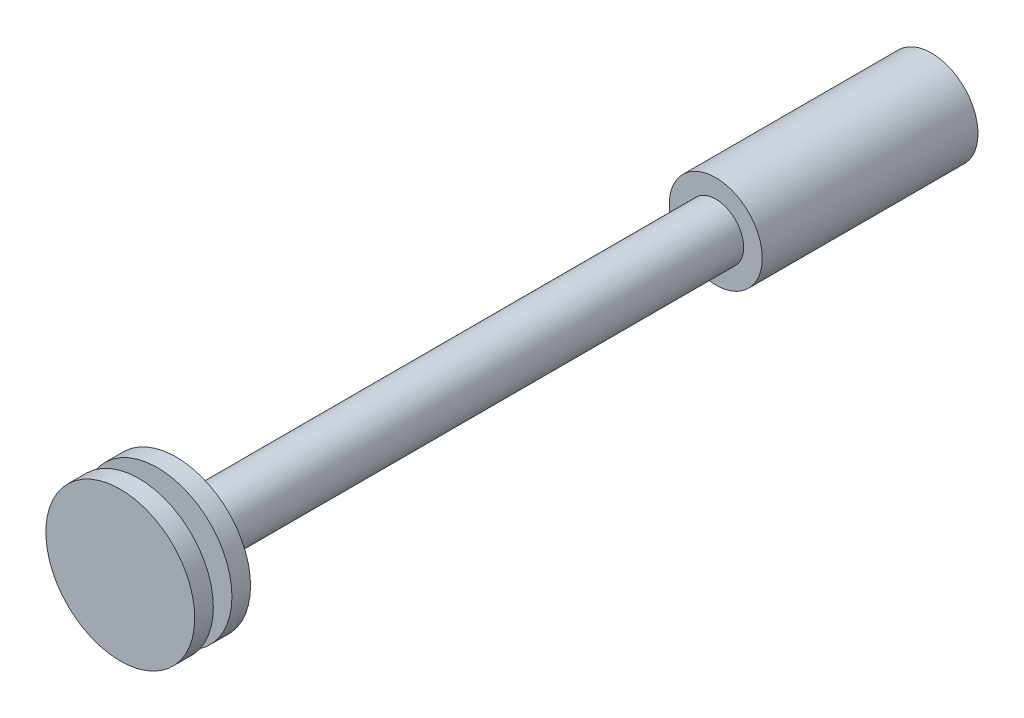
ISO-10303-21;
HEADER;
FILE_DESCRIPTION(('STEP AP214'),'2;1');
FILE_NAME('part.step','',(''),(''),'','','');
FILE_SCHEMA(('AUTOMOTIVE_DESIGN { 1 0 10303 214 1 1 1 1 }'));
ENDSEC;
DATA;
#1=APPLICATION_CONTEXT('core data for automotive mechanical design processes');
#2=APPLICATION_PROTOCOL_DEFINITION('international standard','automotive_design',2000,#1);
#3=PRODUCT_CONTEXT('',#1,'mechanical');
#4=PRODUCT('Part','Part','',(#3));
#5=PRODUCT_RELATED_PRODUCT_CATEGORY('part','',(#4));
#6=PRODUCT_DEFINITION_FORMATION('','',#4);
#7=PRODUCT_DEFINITION_CONTEXT('part definition',#1,'design');
#8=PRODUCT_DEFINITION('design','',#6,#7);
#9=PRODUCT_DEFINITION_SHAPE('','',#8);
#10=(LENGTH_UNIT() NAMED_UNIT(*) SI_UNIT(.MILLI.,.METRE.));
#11=(NAMED_UNIT(*) PLANE_ANGLE_UNIT() SI_UNIT($,.RADIAN.));
#12=(NAMED_UNIT(*) SI_UNIT($,.STERADIAN.) SOLID_ANGLE_UNIT());
#13=UNCERTAINTY_MEASURE_WITH_UNIT(LENGTH_MEASURE(1.E-05),#10,'distance_accuracy_value','');
#14=(GEOMETRIC_REPRESENTATION_CONTEXT(3) GLOBAL_UNCERTAINTY_ASSIGNED_CONTEXT((#13)) GLOBAL_UNIT_ASSIGNED_CONTEXT((#10,
#11,#12)) REPRESENTATION_CONTEXT('',''));
#15=CARTESIAN_POINT('',(0.,0.,0.));
#16=DIRECTION('',(0.,0.,1.));
#17=DIRECTION('',(1.,0.,0.));
#18=AXIS2_PLACEMENT_3D('',#15,#16,#17);
#19=CARTESIAN_POINT('',(0.,0.,60.));
#20=DIRECTION('',(0.,0.,1.));
#21=DIRECTION('',(1.,0.,0.));
#22=AXIS2_PLACEMENT_3D('',#19,#20,#21);
#23=CYLINDRICAL_SURFACE('',#22,5.);
#24=CARTESIAN_POINT('',(0.,0.,96.8123621490339));
#25=DIRECTION('',(0.,0.,1.));
#26=DIRECTION('',(1.,0.,0.));
#27=AXIS2_PLACEMENT_3D('',#24,#25,#26);
#28=CIRCLE('',#27,5.);
#29=CARTESIAN_POINT('',(5.,0.,96.8123621490339));
#30=VERTEX_POINT('',#29);
#31=EDGE_CURVE('E44',#30,#30,#28,.F.);
#32=ORIENTED_EDGE('',*,*,#31,.F.);
#33=EDGE_LOOP('',(#32));
#34=FACE_BOUND('',#33,.T.);
#35=CARTESIAN_POINT('',(0.,0.,120.));
#36=DIRECTION('',(0.,0.,1.));
#37=DIRECTION('',(1.,0.,0.));
#38=AXIS2_PLACEMENT_3D('',#35,#36,#37);
#39=CIRCLE('',#38,5.);
#40=CARTESIAN_POINT('',(5.,0.,120.));
#41=VERTEX_POINT('',#40);
#42=EDGE_CURVE('E71',#41,#41,#39,.T.);
#43=ORIENTED_EDGE('',*,*,#42,.F.);
#44=EDGE_LOOP('',(#43));
#45=FACE_BOUND('',#44,.T.);
#46=ADVANCED_FACE('F40',(#34,#45),#23,.T.);
#47=CARTESIAN_POINT('',(0.,0.,120.));
#48=DIRECTION('',(0.,0.,1.));
#49=DIRECTION('',(1.,0.,0.));
#50=AXIS2_PLACEMENT_3D('',#47,#48,#49);
#51=PLANE('',#50);
#52=CARTESIAN_POINT('',(0.,0.,120.));
#53=DIRECTION('',(0.,0.,1.));
#54=DIRECTION('',(1.,0.,0.));
#55=AXIS2_PLACEMENT_3D('',#52,#53,#54);
#56=CIRCLE('',#55,3.);
#57=CARTESIAN_POINT('',(-3.,0.,120.));
#58=VERTEX_POINT('',#57);
#59=EDGE_CURVE('E67',#58,#58,#56,.T.);
#60=ORIENTED_EDGE('',*,*,#59,.F.);
#61=EDGE_LOOP('',(#60));
#62=FACE_BOUND('',#61,.T.);
#63=ORIENTED_EDGE('',*,*,#42,.T.);
#64=EDGE_LOOP('',(#63));
#65=FACE_BOUND('',#64,.T.);
#66=ADVANCED_FACE('F111',(#62,#65),#51,.T.);
#67=CARTESIAN_POINT('',(0.,0.,184.));
#68=DIRECTION('',(0.,0.,1.));
#69=DIRECTION('',(1.,0.,0.));
#70=AXIS2_PLACEMENT_3D('',#67,#68,#69);
#71=PLANE('',#70);
#72=CARTESIAN_POINT('',(0.,0.,184.));
#73=DIRECTION('',(0.,0.,1.));
#74=DIRECTION('',(1.,0.,0.));
#75=AXIS2_PLACEMENT_3D('',#72,#73,#74);
#76=CIRCLE('',#75,8.);
#77=CARTESIAN_POINT('',(8.,0.,184.));
#78=VERTEX_POINT('',#77);
#79=EDGE_CURVE('E77',#78,#78,#76,.T.);
#80=ORIENTED_EDGE('',*,*,#79,.T.);
#81=EDGE_LOOP('',(#80));
#82=FACE_BOUND('',#81,.T.);
#83=ADVANCED_FACE('F119',(#82),#71,.T.);
#84=CARTESIAN_POINT('',(0.,0.,184.));
#85=DIRECTION('',(0.,0.,-1.));
#86=DIRECTION('',(-1.,0.,0.));
#87=AXIS2_PLACEMENT_3D('',#84,#85,#86);
#88=CYLINDRICAL_SURFACE('',#87,8.);
#89=ORIENTED_EDGE('',*,*,#79,.F.);
#90=EDGE_LOOP('',(#89));
#91=FACE_BOUND('',#90,.T.);
#92=CARTESIAN_POINT('',(0.,0.,182.));
#93=DIRECTION('',(0.,0.,1.));
#94=DIRECTION('',(1.,0.,0.));
#95=AXIS2_PLACEMENT_3D('',#92,#93,#94);
#96=CIRCLE('',#95,8.);
#97=CARTESIAN_POINT('',(8.,0.,182.));
#98=VERTEX_POINT('',#97);
#99=EDGE_CURVE('E70',#98,#98,#96,.T.);
#100=ORIENTED_EDGE('',*,*,#99,.T.);
#101=EDGE_LOOP('',(#100));
#102=FACE_BOUND('',#101,.T.);
#103=ADVANCED_FACE('F106',(#91,#102),#88,.T.);
#104=CARTESIAN_POINT('',(0.,0.,182.));
#105=DIRECTION('',(0.,0.,1.));
#106=DIRECTION('',(1.,0.,0.));
#107=AXIS2_PLACEMENT_3D('',#104,#105,#106);
#108=PLANE('',#107);
#109=CARTESIAN_POINT('',(0.,0.,182.));
#110=DIRECTION('',(0.,0.,1.));
#111=DIRECTION('',(1.,0.,0.));
#112=AXIS2_PLACEMENT_3D('',#109,#110,#111);
#113=CIRCLE('',#112,3.);
#114=CARTESIAN_POINT('',(3.,0.,182.));
#115=VERTEX_POINT('',#114);
#116=EDGE_CURVE('E59',#115,#115,#113,.T.);
#117=ORIENTED_EDGE('',*,*,#116,.T.);
#118=EDGE_LOOP('',(#117));
#119=FACE_BOUND('',#118,.T.);
#120=ORIENTED_EDGE('',*,*,#99,.F.);
#121=EDGE_LOOP('',(#120));
#122=FACE_BOUND('',#121,.T.);
#123=ADVANCED_FACE('F93',(#119,#122),#108,.F.);
#124=CARTESIAN_POINT('',(0.,0.,182.));
#125=DIRECTION('',(0.,0.,-1.));
#126=DIRECTION('',(-1.,0.,0.));
#127=AXIS2_PLACEMENT_3D('',#124,#125,#126);
#128=CYLINDRICAL_SURFACE('',#127,3.);
#129=ORIENTED_EDGE('',*,*,#116,.F.);
#130=EDGE_LOOP('',(#129));
#131=FACE_BOUND('',#130,.T.);
#132=CARTESIAN_POINT('',(0.,0.,180.));
#133=DIRECTION('',(0.,0.,1.));
#134=DIRECTION('',(1.,0.,0.));
#135=AXIS2_PLACEMENT_3D('',#132,#133,#134);
#136=CIRCLE('',#135,3.);
#137=CARTESIAN_POINT('',(3.,0.,180.));
#138=VERTEX_POINT('',#137);
#139=EDGE_CURVE('E10',#138,#138,#136,.T.);
#140=ORIENTED_EDGE('',*,*,#139,.T.);
#141=EDGE_LOOP('',(#140));
#142=FACE_BOUND('',#141,.T.);
#143=ADVANCED_FACE('F96',(#131,#142),#128,.T.);
#144=CARTESIAN_POINT('',(0.,0.,180.));
#145=DIRECTION('',(0.,0.,1.));
#146=DIRECTION('',(1.,0.,0.));
#147=AXIS2_PLACEMENT_3D('',#144,#145,#146);
#148=PLANE('',#147);
#149=ORIENTED_EDGE('',*,*,#139,.F.);
#150=EDGE_LOOP('',(#149));
#151=FACE_BOUND('',#150,.T.);
#152=CARTESIAN_POINT('',(0.,0.,180.));
#153=DIRECTION('',(0.,0.,1.));
#154=DIRECTION('',(1.,0.,0.));
#155=AXIS2_PLACEMENT_3D('',#152,#153,#154);
#156=CIRCLE('',#155,8.);
#157=CARTESIAN_POINT('',(8.,0.,180.));
#158=VERTEX_POINT('',#157);
#159=EDGE_CURVE('E64',#158,#158,#156,.T.);
#160=ORIENTED_EDGE('',*,*,#159,.T.);
#161=EDGE_LOOP('',(#160));
#162=FACE_BOUND('',#161,.T.);
#163=ADVANCED_FACE('F98',(#151,#162),#148,.T.);
#164=CARTESIAN_POINT('',(0.,0.,178.));
#165=DIRECTION('',(0.,0.,1.));
#166=DIRECTION('',(1.,0.,0.));
#167=AXIS2_PLACEMENT_3D('',#164,#165,#166);
#168=CYLINDRICAL_SURFACE('',#167,8.);
#169=CARTESIAN_POINT('',(0.,0.,178.));
#170=DIRECTION('',(0.,0.,1.));
#171=DIRECTION('',(1.,0.,0.));
#172=AXIS2_PLACEMENT_3D('',#169,#170,#171);
#173=CIRCLE('',#172,8.);
#174=CARTESIAN_POINT('',(8.,0.,178.));
#175=VERTEX_POINT('',#174);
#176=EDGE_CURVE('E55',#175,#175,#173,.T.);
#177=ORIENTED_EDGE('',*,*,#176,.T.);
#178=EDGE_LOOP('',(#177));
#179=FACE_BOUND('',#178,.T.);
#180=ORIENTED_EDGE('',*,*,#159,.F.);
#181=EDGE_LOOP('',(#180));
#182=FACE_BOUND('',#181,.T.);
#183=ADVANCED_FACE('F104',(#179,#182),#168,.T.);
#184=CARTESIAN_POINT('',(0.,0.,178.));
#185=DIRECTION('',(0.,0.,1.));
#186=DIRECTION('',(1.,0.,0.));
#187=AXIS2_PLACEMENT_3D('',#184,#185,#186);
#188=PLANE('',#187);
#189=CARTESIAN_POINT('',(0.,0.,178.));
#190=DIRECTION('',(0.,0.,1.));
#191=DIRECTION('',(1.,0.,0.));
#192=AXIS2_PLACEMENT_3D('',#189,#190,#191);
#193=CIRCLE('',#192,3.);
#194=CARTESIAN_POINT('',(-3.,0.,178.));
#195=VERTEX_POINT('',#194);
#196=EDGE_CURVE('E49',#195,#195,#193,.T.);
#197=ORIENTED_EDGE('',*,*,#196,.T.);
#198=EDGE_LOOP('',(#197));
#199=FACE_BOUND('',#198,.T.);
#200=ORIENTED_EDGE('',*,*,#176,.F.);
#201=EDGE_LOOP('',(#200));
#202=FACE_BOUND('',#201,.T.);
#203=ADVANCED_FACE('F159',(#199,#202),#188,.F.);
#204=CARTESIAN_POINT('',(0.,0.,180.));
#205=DIRECTION('',(0.,0.,-1.));
#206=DIRECTION('',(-1.,0.,0.));
#207=AXIS2_PLACEMENT_3D('',#204,#205,#206);
#208=CYLINDRICAL_SURFACE('',#207,3.);
#209=CARTESIAN_POINT('',(-3.,0.,120.));
#210=CARTESIAN_POINT('',(-3.,0.,120.604166666667));
#211=CARTESIAN_POINT('',(-3.,0.,121.208333333333));
#212=CARTESIAN_POINT('',(-3.,0.,122.416666666667));
#213=CARTESIAN_POINT('',(-3.,0.,123.020833333333));
#214=CARTESIAN_POINT('',(-3.,0.,124.229166666667));
#215=CARTESIAN_POINT('',(-3.,0.,124.833333333333));
#216=CARTESIAN_POINT('',(-3.,0.,126.041666666667));
#217=CARTESIAN_POINT('',(-3.,0.,126.645833333333));
#218=CARTESIAN_POINT('',(-3.,0.,127.854166666667));
#219=CARTESIAN_POINT('',(-3.,0.,128.458333333333));
#220=CARTESIAN_POINT('',(-3.,0.,129.666666666667));
#221=CARTESIAN_POINT('',(-3.,0.,130.270833333333));
#222=CARTESIAN_POINT('',(-3.,0.,131.479166666667));
#223=CARTESIAN_POINT('',(-3.,0.,132.083333333333));
#224=CARTESIAN_POINT('',(-3.,0.,133.291666666667));
#225=CARTESIAN_POINT('',(-3.,0.,133.895833333333));
#226=CARTESIAN_POINT('',(-3.,0.,135.104166666667));
#227=CARTESIAN_POINT('',(-3.,0.,135.708333333333));
#228=CARTESIAN_POINT('',(-3.,0.,136.916666666667));
#229=CARTESIAN_POINT('',(-3.,0.,137.520833333333));
#230=CARTESIAN_POINT('',(-3.,0.,138.729166666667));
#231=CARTESIAN_POINT('',(-3.,0.,139.333333333333));
#232=CARTESIAN_POINT('',(-3.,0.,140.541666666667));
#233=CARTESIAN_POINT('',(-3.,0.,141.145833333333));
#234=CARTESIAN_POINT('',(-3.,0.,142.354166666667));
#235=CARTESIAN_POINT('',(-3.,0.,142.958333333333));
#236=CARTESIAN_POINT('',(-3.,0.,144.166666666667));
#237=CARTESIAN_POINT('',(-3.,0.,144.770833333333));
#238=CARTESIAN_POINT('',(-3.,0.,145.979166666667));
#239=CARTESIAN_POINT('',(-3.,0.,146.583333333333));
#240=CARTESIAN_POINT('',(-3.,0.,147.791666666667));
#241=CARTESIAN_POINT('',(-3.,0.,148.395833333333));
#242=CARTESIAN_POINT('',(-3.,0.,149.604166666667));
#243=CARTESIAN_POINT('',(-3.,0.,150.208333333333));
#244=CARTESIAN_POINT('',(-3.,0.,151.416666666667));
#245=CARTESIAN_POINT('',(-3.,0.,152.020833333333));
#246=CARTESIAN_POINT('',(-3.,0.,153.229166666667));
#247=CARTESIAN_POINT('',(-3.,0.,153.833333333333));
#248=CARTESIAN_POINT('',(-3.,0.,155.041666666667));
#249=CARTESIAN_POINT('',(-3.,0.,155.645833333333));
#250=CARTESIAN_POINT('',(-3.,0.,156.854166666667));
#251=CARTESIAN_POINT('',(-3.,0.,157.458333333333));
#252=CARTESIAN_POINT('',(-3.,0.,158.666666666667));
#253=CARTESIAN_POINT('',(-3.,0.,159.270833333333));
#254=CARTESIAN_POINT('',(-3.,0.,160.479166666667));
#255=CARTESIAN_POINT('',(-3.,0.,161.083333333333));
#256=CARTESIAN_POINT('',(-3.,0.,162.291666666667));
#257=CARTESIAN_POINT('',(-3.,0.,162.895833333333));
#258=CARTESIAN_POINT('',(-3.,0.,164.104166666667));
#259=CARTESIAN_POINT('',(-3.,0.,164.708333333333));
#260=CARTESIAN_POINT('',(-3.,0.,165.916666666667));
#261=CARTESIAN_POINT('',(-3.,0.,166.520833333333));
#262=CARTESIAN_POINT('',(-3.,0.,167.729166666667));
#263=CARTESIAN_POINT('',(-3.,0.,168.333333333333));
#264=CARTESIAN_POINT('',(-3.,0.,169.541666666667));
#265=CARTESIAN_POINT('',(-3.,0.,170.145833333333));
#266=CARTESIAN_POINT('',(-3.,0.,171.354166666667));
#267=CARTESIAN_POINT('',(-3.,0.,171.958333333333));
#268=CARTESIAN_POINT('',(-3.,0.,173.166666666667));
#269=CARTESIAN_POINT('',(-3.,0.,173.770833333333));
#270=CARTESIAN_POINT('',(-3.,0.,174.979166666667));
#271=CARTESIAN_POINT('',(-3.,0.,175.583333333333));
#272=CARTESIAN_POINT('',(-3.,0.,176.791666666667));
#273=CARTESIAN_POINT('',(-3.,0.,177.395833333333));
#274=CARTESIAN_POINT('',(-3.,0.,178.));
#275=B_SPLINE_CURVE_WITH_KNOTS('',3,(#209,#210,#211,#212,#213,#214,#215,#216,#217,#218,#219,
#220,#221,#222,#223,#224,#225,#226,#227,#228,#229,#230,#231,#232,#233,#234,#235,#236,#237,#238,
#239,#240,#241,#242,#243,#244,#245,#246,#247,#248,#249,#250,#251,#252,#253,#254,#255,#256,#257,
#258,#259,#260,#261,#262,#263,#264,#265,#266,#267,#268,#269,#270,#271,#272,#273,#274),
.UNSPECIFIED.,.F.,.F.,(4,2,2,2,2,2,2,2,2,2,2,2,2,2,2,2,2,2,2,2,2,2,2,2,2,2,2,2,2,2,2,2,4),(0.,
1.81249999999999,3.62499999999999,5.43749999999998,7.24999999999998,9.0625,10.875,12.6875,14.5,
16.3125,18.125,19.9375,21.75,23.5625,25.375,27.1875,29.,30.8125,32.625,34.4375,36.25,38.0625,
39.875,41.6875,43.5,45.3125,47.125,48.9375,50.75,52.5625,54.375,56.1875,58.),.UNSPECIFIED.);
#276=EDGE_CURVE('BSEAM42',#58,#195,#275,.T.);
#277=ORIENTED_EDGE('',*,*,#59,.T.);
#278=ORIENTED_EDGE('',*,*,#196,.F.);
#279=ORIENTED_EDGE('',*,*,#276,.T.);
#280=ORIENTED_EDGE('',*,*,#276,.F.);
#281=EDGE_LOOP('',(#277,#279,#278,#280));
#282=FACE_BOUND('',#281,.T.);
#283=ADVANCED_FACE('F42',(#282),#208,.T.);
#284=CARTESIAN_POINT('',(-8.,22.8607152885849,96.8123621490339));
#285=DIRECTION('',(0.,0.,1.));
#286=DIRECTION('',(1.,0.,0.));
#287=AXIS2_PLACEMENT_3D('',#284,#285,#286);
#288=PLANE('',#287);
#289=ORIENTED_EDGE('',*,*,#31,.T.);
#290=EDGE_LOOP('',(#289));
#291=FACE_BOUND('',#290,.T.);
#292=ADVANCED_FACE('F158',(#291),#288,.F.);
#293=CLOSED_SHELL('',(#46,#66,#83,#103,#123,#143,#163,#183,#203,#283,#292));
#294=MANIFOLD_SOLID_BREP('B2',#293);
#295=ADVANCED_BREP_SHAPE_REPRESENTATION('',(#18,#294),#14);
#296=SHAPE_DEFINITION_REPRESENTATION(#9,#295);
ENDSEC;
END-ISO-10303-21;
